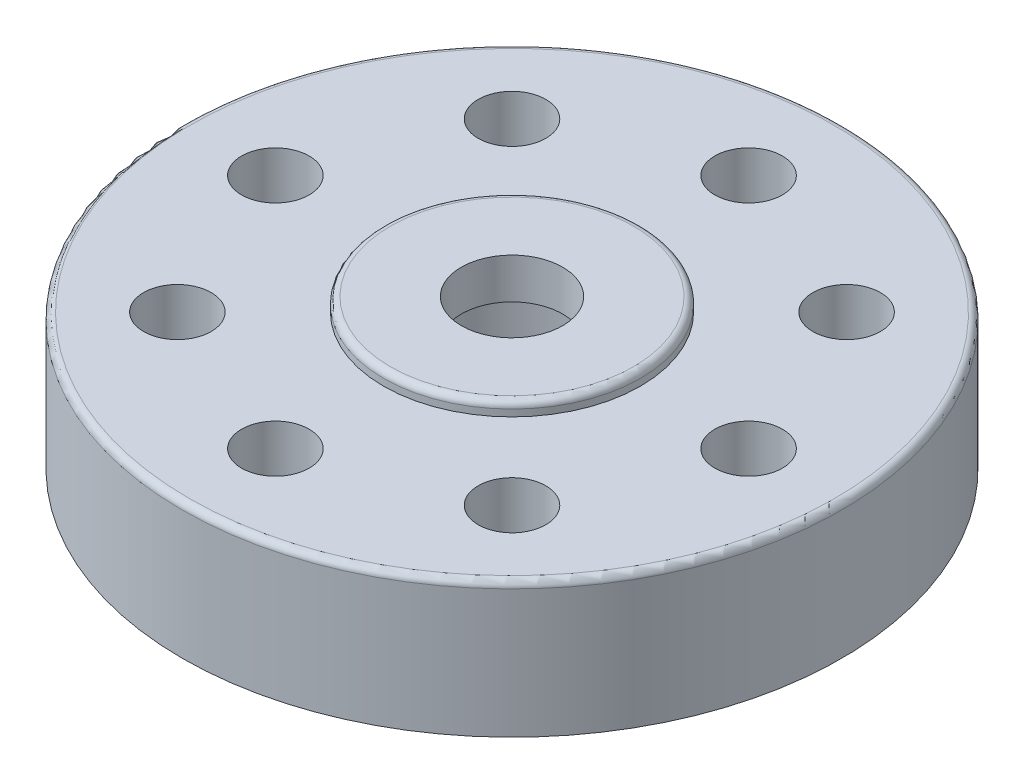
ISO-10303-21;
HEADER;
FILE_DESCRIPTION(('STEP AP214'),'2;1');
FILE_NAME('part.step','',(''),(''),'','','');
FILE_SCHEMA(('AUTOMOTIVE_DESIGN { 1 0 10303 214 1 1 1 1 }'));
ENDSEC;
DATA;
#1=APPLICATION_CONTEXT('core data for automotive mechanical design processes');
#2=APPLICATION_PROTOCOL_DEFINITION('international standard','automotive_design',2000,#1);
#3=PRODUCT_CONTEXT('',#1,'mechanical');
#4=PRODUCT('Part','Part','',(#3));
#5=PRODUCT_RELATED_PRODUCT_CATEGORY('part','',(#4));
#6=PRODUCT_DEFINITION_FORMATION('','',#4);
#7=PRODUCT_DEFINITION_CONTEXT('part definition',#1,'design');
#8=PRODUCT_DEFINITION('design','',#6,#7);
#9=PRODUCT_DEFINITION_SHAPE('','',#8);
#10=(LENGTH_UNIT() NAMED_UNIT(*) SI_UNIT(.MILLI.,.METRE.));
#11=(NAMED_UNIT(*) PLANE_ANGLE_UNIT() SI_UNIT($,.RADIAN.));
#12=(NAMED_UNIT(*) SI_UNIT($,.STERADIAN.) SOLID_ANGLE_UNIT());
#13=UNCERTAINTY_MEASURE_WITH_UNIT(LENGTH_MEASURE(1.E-05),#10,'distance_accuracy_value','');
#14=(GEOMETRIC_REPRESENTATION_CONTEXT(3) GLOBAL_UNCERTAINTY_ASSIGNED_CONTEXT((#13)) GLOBAL_UNIT_ASSIGNED_CONTEXT((#10,
#11,#12)) REPRESENTATION_CONTEXT('',''));
#15=CARTESIAN_POINT('',(0.,0.,0.));
#16=DIRECTION('',(0.,0.,1.));
#17=DIRECTION('',(1.,0.,0.));
#18=AXIS2_PLACEMENT_3D('',#15,#16,#17);
#19=CARTESIAN_POINT('',(29.5924554137643,49.1135937849813,41.6369385314129));
#20=DIRECTION('',(0.,1.,0.));
#21=DIRECTION('',(0.,0.,1.));
#22=AXIS2_PLACEMENT_3D('',#19,#20,#21);
#23=TOROIDAL_SURFACE('',#22,9.55,0.2);
#24=CARTESIAN_POINT('',(29.5924554137643,49.1135937849813,41.6369385314129));
#25=DIRECTION('',(0.,-1.,0.));
#26=DIRECTION('',(0.,0.,1.));
#27=AXIS2_PLACEMENT_3D('',#24,#25,#26);
#28=CIRCLE('',#27,9.75);
#29=CARTESIAN_POINT('',(29.5924554137643,49.1135937849813,51.3869385314129));
#30=VERTEX_POINT('',#29);
#31=EDGE_CURVE('E215',#30,#30,#28,.T.);
#32=ORIENTED_EDGE('',*,*,#31,.F.);
#33=EDGE_LOOP('',(#32));
#34=FACE_BOUND('',#33,.T.);
#35=CARTESIAN_POINT('',(29.5924554137643,49.3135937849813,41.6369385314129));
#36=DIRECTION('',(0.,1.,0.));
#37=DIRECTION('',(0.,0.,1.));
#38=AXIS2_PLACEMENT_3D('',#35,#36,#37);
#39=CIRCLE('',#38,9.55);
#40=CARTESIAN_POINT('',(29.5924554137643,49.3135937849813,51.1869385314129));
#41=VERTEX_POINT('',#40);
#42=EDGE_CURVE('E162',#41,#41,#39,.T.);
#43=ORIENTED_EDGE('',*,*,#42,.F.);
#44=EDGE_LOOP('',(#43));
#45=FACE_BOUND('',#44,.T.);
#46=ADVANCED_FACE('F15',(#34,#45),#23,.T.);
#47=CARTESIAN_POINT('',(29.5924554137643,49.5135937849813,41.6369385314129));
#48=DIRECTION('',(0.,1.,0.));
#49=DIRECTION('',(0.,0.,1.));
#50=AXIS2_PLACEMENT_3D('',#47,#48,#49);
#51=TOROIDAL_SURFACE('',#50,3.6,0.2);
#52=CARTESIAN_POINT('',(29.5924554137643,49.5135937849813,41.6369385314129));
#53=DIRECTION('',(0.,-1.,0.));
#54=DIRECTION('',(0.,0.,1.));
#55=AXIS2_PLACEMENT_3D('',#52,#53,#54);
#56=CIRCLE('',#55,3.8);
#57=CARTESIAN_POINT('',(29.5924554137643,49.5135937849813,45.4369385314129));
#58=VERTEX_POINT('',#57);
#59=EDGE_CURVE('E223',#58,#58,#56,.T.);
#60=ORIENTED_EDGE('',*,*,#59,.F.);
#61=EDGE_LOOP('',(#60));
#62=FACE_BOUND('',#61,.T.);
#63=CARTESIAN_POINT('',(29.5924554137643,49.7135937849813,41.6369385314129));
#64=DIRECTION('',(0.,1.,0.));
#65=DIRECTION('',(0.,0.,1.));
#66=AXIS2_PLACEMENT_3D('',#63,#64,#65);
#67=CIRCLE('',#66,3.6);
#68=CARTESIAN_POINT('',(29.5924554137643,49.7135937849813,45.2369385314129));
#69=VERTEX_POINT('',#68);
#70=EDGE_CURVE('E206',#69,#69,#67,.T.);
#71=ORIENTED_EDGE('',*,*,#70,.F.);
#72=EDGE_LOOP('',(#71));
#73=FACE_BOUND('',#72,.T.);
#74=ADVANCED_FACE('F557',(#62,#73),#51,.T.);
#75=CARTESIAN_POINT('',(29.5924554137643,48.5135937849813,41.6369385314129));
#76=DIRECTION('',(0.,1.,0.));
#77=DIRECTION('',(0.,0.,1.));
#78=AXIS2_PLACEMENT_3D('',#75,#76,#77);
#79=CYLINDRICAL_SURFACE('',#78,1.5);
#80=CARTESIAN_POINT('',(29.5924554137643,48.5135937849813,41.6369385314129));
#81=DIRECTION('',(0.,1.,0.));
#82=DIRECTION('',(0.,0.,1.));
#83=AXIS2_PLACEMENT_3D('',#80,#81,#82);
#84=CIRCLE('',#83,1.5);
#85=CARTESIAN_POINT('',(29.5924554137643,48.5135937849813,43.1369385314129));
#86=VERTEX_POINT('',#85);
#87=EDGE_CURVE('E10',#86,#86,#84,.T.);
#88=ORIENTED_EDGE('',*,*,#87,.F.);
#89=EDGE_LOOP('',(#88));
#90=FACE_BOUND('',#89,.T.);
#91=CARTESIAN_POINT('',(29.5924554137643,49.7135937849813,41.6369385314129));
#92=DIRECTION('',(0.,1.,0.));
#93=DIRECTION('',(0.,0.,1.));
#94=AXIS2_PLACEMENT_3D('',#91,#92,#93);
#95=CIRCLE('',#94,1.5);
#96=CARTESIAN_POINT('',(29.5924554137643,49.7135937849813,43.1369385314129));
#97=VERTEX_POINT('',#96);
#98=EDGE_CURVE('E202',#97,#97,#95,.T.);
#99=ORIENTED_EDGE('',*,*,#98,.T.);
#100=EDGE_LOOP('',(#99));
#101=FACE_BOUND('',#100,.T.);
#102=ADVANCED_FACE('F370',(#90,#101),#79,.F.);
#103=CARTESIAN_POINT('',(29.5924554137643,48.5135937849813,41.6369385314129));
#104=DIRECTION('',(0.,1.,0.));
#105=DIRECTION('',(1.,0.,0.));
#106=AXIS2_PLACEMENT_3D('',#103,#104,#105);
#107=PLANE('',#106);
#108=ORIENTED_EDGE('',*,*,#87,.T.);
#109=EDGE_LOOP('',(#108));
#110=FACE_BOUND('',#109,.T.);
#111=CARTESIAN_POINT('',(29.5924554137643,48.5135937849813,41.6369385314129));
#112=DIRECTION('',(0.,1.,0.));
#113=DIRECTION('',(0.,0.,1.));
#114=AXIS2_PLACEMENT_3D('',#111,#112,#113);
#115=CIRCLE('',#114,2.75);
#116=CARTESIAN_POINT('',(29.5924554137643,48.5135937849813,44.3869385314129));
#117=VERTEX_POINT('',#116);
#118=EDGE_CURVE('E23',#117,#117,#115,.T.);
#119=ORIENTED_EDGE('',*,*,#118,.F.);
#120=EDGE_LOOP('',(#119));
#121=FACE_BOUND('',#120,.T.);
#122=ADVANCED_FACE('F364',(#110,#121),#107,.F.);
#123=CARTESIAN_POINT('',(29.5924554137643,48.5135937849813,41.6369385314129));
#124=DIRECTION('',(0.,1.,0.));
#125=DIRECTION('',(0.,0.,1.));
#126=AXIS2_PLACEMENT_3D('',#123,#124,#125);
#127=CYLINDRICAL_SURFACE('',#126,2.75);
#128=ORIENTED_EDGE('',*,*,#118,.T.);
#129=EDGE_LOOP('',(#128));
#130=FACE_BOUND('',#129,.T.);
#131=CARTESIAN_POINT('',(29.5924554137643,49.3135937849813,41.6369385314129));
#132=DIRECTION('',(0.,1.,0.));
#133=DIRECTION('',(0.,0.,1.));
#134=AXIS2_PLACEMENT_3D('',#131,#132,#133);
#135=CIRCLE('',#134,2.75);
#136=CARTESIAN_POINT('',(29.5924554137643,49.3135937849813,44.3869385314129));
#137=VERTEX_POINT('',#136);
#138=EDGE_CURVE('E205',#137,#137,#135,.T.);
#139=ORIENTED_EDGE('',*,*,#138,.F.);
#140=EDGE_LOOP('',(#139));
#141=FACE_BOUND('',#140,.T.);
#142=ADVANCED_FACE('F369',(#130,#141),#127,.T.);
#143=CARTESIAN_POINT('',(29.5924554137643,49.7135937849813,41.6369385314129));
#144=DIRECTION('',(0.,-1.,0.));
#145=DIRECTION('',(0.,0.,-1.));
#146=AXIS2_PLACEMENT_3D('',#143,#144,#145);
#147=CYLINDRICAL_SURFACE('',#146,3.8);
#148=ORIENTED_EDGE('',*,*,#59,.T.);
#149=EDGE_LOOP('',(#148));
#150=FACE_BOUND('',#149,.T.);
#151=CARTESIAN_POINT('',(29.5924554137643,49.3135937849813,41.6369385314129));
#152=DIRECTION('',(0.,1.,0.));
#153=DIRECTION('',(0.,0.,1.));
#154=AXIS2_PLACEMENT_3D('',#151,#152,#153);
#155=CIRCLE('',#154,3.8);
#156=CARTESIAN_POINT('',(29.5924554137643,49.3135937849813,45.4369385314129));
#157=VERTEX_POINT('',#156);
#158=EDGE_CURVE('E170',#157,#157,#155,.T.);
#159=ORIENTED_EDGE('',*,*,#158,.T.);
#160=EDGE_LOOP('',(#159));
#161=FACE_BOUND('',#160,.T.);
#162=ADVANCED_FACE('F406',(#150,#161),#147,.T.);
#163=CARTESIAN_POINT('',(29.5924554137643,49.3135937849813,41.6369385314129));
#164=DIRECTION('',(0.,1.,0.));
#165=DIRECTION('',(1.,0.,0.));
#166=AXIS2_PLACEMENT_3D('',#163,#164,#165);
#167=PLANE('',#166);
#168=ORIENTED_EDGE('',*,*,#138,.T.);
#169=EDGE_LOOP('',(#168));
#170=FACE_BOUND('',#169,.T.);
#171=CARTESIAN_POINT('',(29.5924554137643,49.3135937849813,41.6369385314129));
#172=DIRECTION('',(0.,1.,0.));
#173=DIRECTION('',(0.,0.,1.));
#174=AXIS2_PLACEMENT_3D('',#171,#172,#173);
#175=CIRCLE('',#174,3.);
#176=CARTESIAN_POINT('',(29.5924554137643,49.3135937849813,44.6369385314129));
#177=VERTEX_POINT('',#176);
#178=EDGE_CURVE('E218',#177,#177,#175,.T.);
#179=ORIENTED_EDGE('',*,*,#178,.F.);
#180=EDGE_LOOP('',(#179));
#181=FACE_BOUND('',#180,.T.);
#182=ADVANCED_FACE('F410',(#170,#181),#167,.F.);
#183=CARTESIAN_POINT('',(29.5924554137643,49.7135937849813,41.6369385314129));
#184=DIRECTION('',(0.,1.,0.));
#185=DIRECTION('',(1.,0.,0.));
#186=AXIS2_PLACEMENT_3D('',#183,#184,#185);
#187=PLANE('',#186);
#188=ORIENTED_EDGE('',*,*,#98,.F.);
#189=EDGE_LOOP('',(#188));
#190=FACE_BOUND('',#189,.T.);
#191=ORIENTED_EDGE('',*,*,#70,.T.);
#192=EDGE_LOOP('',(#191));
#193=FACE_BOUND('',#192,.T.);
#194=ADVANCED_FACE('F422',(#190,#193),#187,.T.);
#195=CARTESIAN_POINT('',(34.5422028820702,49.3135937849813,36.6871910631072));
#196=DIRECTION('',(0.,-1.,0.));
#197=DIRECTION('',(0.,0.,-1.));
#198=AXIS2_PLACEMENT_3D('',#195,#196,#197);
#199=CYLINDRICAL_SURFACE('',#198,1.);
#200=CARTESIAN_POINT('',(34.5422028820702,49.3135937849813,36.6871910631072));
#201=DIRECTION('',(0.,1.,0.));
#202=DIRECTION('',(0.,0.,1.));
#203=AXIS2_PLACEMENT_3D('',#200,#201,#202);
#204=CIRCLE('',#203,1.);
#205=CARTESIAN_POINT('',(34.5422028820702,49.3135937849813,37.6871910631072));
#206=VERTEX_POINT('',#205);
#207=EDGE_CURVE('E153',#206,#206,#204,.T.);
#208=ORIENTED_EDGE('',*,*,#207,.T.);
#209=EDGE_LOOP('',(#208));
#210=FACE_BOUND('',#209,.T.);
#211=CARTESIAN_POINT('',(34.5422028820702,45.3135937849813,36.6871910631072));
#212=DIRECTION('',(0.,1.,0.));
#213=DIRECTION('',(0.,0.,1.));
#214=AXIS2_PLACEMENT_3D('',#211,#212,#213);
#215=CIRCLE('',#214,1.);
#216=CARTESIAN_POINT('',(34.5422028820702,45.3135937849813,37.6871910631072));
#217=VERTEX_POINT('',#216);
#218=EDGE_CURVE('E212',#217,#217,#215,.T.);
#219=ORIENTED_EDGE('',*,*,#218,.F.);
#220=EDGE_LOOP('',(#219));
#221=FACE_BOUND('',#220,.T.);
#222=ADVANCED_FACE('F455',(#210,#221),#199,.F.);
#223=CARTESIAN_POINT('',(29.5924554137645,49.3135937849813,34.6369385314129));
#224=DIRECTION('',(0.,-1.,0.));
#225=DIRECTION('',(0.,0.,-1.));
#226=AXIS2_PLACEMENT_3D('',#223,#224,#225);
#227=CYLINDRICAL_SURFACE('',#226,1.);
#228=CARTESIAN_POINT('',(29.5924554137645,49.3135937849813,34.6369385314129));
#229=DIRECTION('',(0.,1.,0.));
#230=DIRECTION('',(0.,0.,1.));
#231=AXIS2_PLACEMENT_3D('',#228,#229,#230);
#232=CIRCLE('',#231,1.);
#233=CARTESIAN_POINT('',(29.5924554137645,49.3135937849813,35.6369385314129));
#234=VERTEX_POINT('',#233);
#235=EDGE_CURVE('E168',#234,#234,#232,.T.);
#236=ORIENTED_EDGE('',*,*,#235,.T.);
#237=EDGE_LOOP('',(#236));
#238=FACE_BOUND('',#237,.T.);
#239=CARTESIAN_POINT('',(29.5924554137645,45.3135937849813,34.6369385314129));
#240=DIRECTION('',(0.,1.,0.));
#241=DIRECTION('',(0.,0.,1.));
#242=AXIS2_PLACEMENT_3D('',#239,#240,#241);
#243=CIRCLE('',#242,1.);
#244=CARTESIAN_POINT('',(29.5924554137645,45.3135937849813,35.6369385314129));
#245=VERTEX_POINT('',#244);
#246=EDGE_CURVE('E183',#245,#245,#243,.T.);
#247=ORIENTED_EDGE('',*,*,#246,.F.);
#248=EDGE_LOOP('',(#247));
#249=FACE_BOUND('',#248,.T.);
#250=ADVANCED_FACE('F459',(#238,#249),#227,.F.);
#251=CARTESIAN_POINT('',(24.6427079454586,49.3135937849813,36.6871910631071));
#252=DIRECTION('',(0.,-1.,0.));
#253=DIRECTION('',(0.,0.,-1.));
#254=AXIS2_PLACEMENT_3D('',#251,#252,#253);
#255=CYLINDRICAL_SURFACE('',#254,1.);
#256=CARTESIAN_POINT('',(24.6427079454586,49.3135937849813,36.6871910631071));
#257=DIRECTION('',(0.,1.,0.));
#258=DIRECTION('',(0.,0.,1.));
#259=AXIS2_PLACEMENT_3D('',#256,#257,#258);
#260=CIRCLE('',#259,1.);
#261=CARTESIAN_POINT('',(24.6427079454586,49.3135937849813,37.6871910631071));
#262=VERTEX_POINT('',#261);
#263=EDGE_CURVE('E147',#262,#262,#260,.T.);
#264=ORIENTED_EDGE('',*,*,#263,.T.);
#265=EDGE_LOOP('',(#264));
#266=FACE_BOUND('',#265,.T.);
#267=CARTESIAN_POINT('',(24.6427079454586,45.3135937849813,36.6871910631071));
#268=DIRECTION('',(0.,1.,0.));
#269=DIRECTION('',(0.,0.,1.));
#270=AXIS2_PLACEMENT_3D('',#267,#268,#269);
#271=CIRCLE('',#270,1.);
#272=CARTESIAN_POINT('',(24.6427079454586,45.3135937849813,37.6871910631071));
#273=VERTEX_POINT('',#272);
#274=EDGE_CURVE('E209',#273,#273,#271,.T.);
#275=ORIENTED_EDGE('',*,*,#274,.F.);
#276=EDGE_LOOP('',(#275));
#277=FACE_BOUND('',#276,.T.);
#278=ADVANCED_FACE('F148',(#266,#277),#255,.F.);
#279=CARTESIAN_POINT('',(22.5924554137643,49.3135937849813,41.6369385314129));
#280=DIRECTION('',(0.,-1.,0.));
#281=DIRECTION('',(0.,0.,-1.));
#282=AXIS2_PLACEMENT_3D('',#279,#280,#281);
#283=CYLINDRICAL_SURFACE('',#282,1.);
#284=CARTESIAN_POINT('',(22.5924554137643,49.3135937849813,41.6369385314129));
#285=DIRECTION('',(0.,1.,0.));
#286=DIRECTION('',(0.,0.,1.));
#287=AXIS2_PLACEMENT_3D('',#284,#285,#286);
#288=CIRCLE('',#287,1.);
#289=CARTESIAN_POINT('',(22.5924554137643,49.3135937849813,42.6369385314129));
#290=VERTEX_POINT('',#289);
#291=EDGE_CURVE('E171',#290,#290,#288,.T.);
#292=ORIENTED_EDGE('',*,*,#291,.T.);
#293=EDGE_LOOP('',(#292));
#294=FACE_BOUND('',#293,.T.);
#295=CARTESIAN_POINT('',(22.5924554137643,45.3135937849813,41.6369385314129));
#296=DIRECTION('',(0.,1.,0.));
#297=DIRECTION('',(0.,0.,1.));
#298=AXIS2_PLACEMENT_3D('',#295,#296,#297);
#299=CIRCLE('',#298,1.);
#300=CARTESIAN_POINT('',(22.5924554137643,45.3135937849813,42.6369385314129));
#301=VERTEX_POINT('',#300);
#302=EDGE_CURVE('E179',#301,#301,#299,.T.);
#303=ORIENTED_EDGE('',*,*,#302,.F.);
#304=EDGE_LOOP('',(#303));
#305=FACE_BOUND('',#304,.T.);
#306=ADVANCED_FACE('F527',(#294,#305),#283,.F.);
#307=CARTESIAN_POINT('',(24.6427079454585,49.3135937849813,46.5866859997187));
#308=DIRECTION('',(0.,-1.,0.));
#309=DIRECTION('',(0.,0.,-1.));
#310=AXIS2_PLACEMENT_3D('',#307,#308,#309);
#311=CYLINDRICAL_SURFACE('',#310,1.);
#312=CARTESIAN_POINT('',(24.6427079454585,49.3135937849813,46.5866859997187));
#313=DIRECTION('',(0.,1.,0.));
#314=DIRECTION('',(0.,0.,1.));
#315=AXIS2_PLACEMENT_3D('',#312,#313,#314);
#316=CIRCLE('',#315,1.);
#317=CARTESIAN_POINT('',(24.6427079454585,49.3135937849813,47.5866859997187));
#318=VERTEX_POINT('',#317);
#319=EDGE_CURVE('E152',#318,#318,#316,.T.);
#320=ORIENTED_EDGE('',*,*,#319,.T.);
#321=EDGE_LOOP('',(#320));
#322=FACE_BOUND('',#321,.T.);
#323=CARTESIAN_POINT('',(24.6427079454585,45.3135937849813,46.5866859997187));
#324=DIRECTION('',(0.,1.,0.));
#325=DIRECTION('',(0.,0.,1.));
#326=AXIS2_PLACEMENT_3D('',#323,#324,#325);
#327=CIRCLE('',#326,1.);
#328=CARTESIAN_POINT('',(24.6427079454585,45.3135937849813,47.5866859997187));
#329=VERTEX_POINT('',#328);
#330=EDGE_CURVE('E201',#329,#329,#327,.T.);
#331=ORIENTED_EDGE('',*,*,#330,.F.);
#332=EDGE_LOOP('',(#331));
#333=FACE_BOUND('',#332,.T.);
#334=ADVANCED_FACE('F384',(#322,#333),#311,.F.);
#335=CARTESIAN_POINT('',(29.5924554137643,49.3135937849813,48.6369385314129));
#336=DIRECTION('',(0.,-1.,0.));
#337=DIRECTION('',(0.,0.,-1.));
#338=AXIS2_PLACEMENT_3D('',#335,#336,#337);
#339=CYLINDRICAL_SURFACE('',#338,1.);
#340=CARTESIAN_POINT('',(29.5924554137643,49.3135937849813,48.6369385314129));
#341=DIRECTION('',(0.,1.,0.));
#342=DIRECTION('',(0.,0.,1.));
#343=AXIS2_PLACEMENT_3D('',#340,#341,#342);
#344=CIRCLE('',#343,1.);
#345=CARTESIAN_POINT('',(29.5924554137643,49.3135937849813,49.6369385314129));
#346=VERTEX_POINT('',#345);
#347=EDGE_CURVE('E180',#346,#346,#344,.T.);
#348=ORIENTED_EDGE('',*,*,#347,.T.);
#349=EDGE_LOOP('',(#348));
#350=FACE_BOUND('',#349,.T.);
#351=CARTESIAN_POINT('',(29.5924554137643,45.3135937849813,48.6369385314129));
#352=DIRECTION('',(0.,1.,0.));
#353=DIRECTION('',(0.,0.,1.));
#354=AXIS2_PLACEMENT_3D('',#351,#352,#353);
#355=CIRCLE('',#354,1.);
#356=CARTESIAN_POINT('',(29.5924554137643,45.3135937849813,49.6369385314129));
#357=VERTEX_POINT('',#356);
#358=EDGE_CURVE('E175',#357,#357,#355,.T.);
#359=ORIENTED_EDGE('',*,*,#358,.F.);
#360=EDGE_LOOP('',(#359));
#361=FACE_BOUND('',#360,.T.);
#362=ADVANCED_FACE('F379',(#350,#361),#339,.F.);
#363=CARTESIAN_POINT('',(34.5422028820702,49.3135937849813,46.5866859997188));
#364=DIRECTION('',(0.,-1.,0.));
#365=DIRECTION('',(0.,0.,-1.));
#366=AXIS2_PLACEMENT_3D('',#363,#364,#365);
#367=CYLINDRICAL_SURFACE('',#366,1.);
#368=CARTESIAN_POINT('',(34.5422028820702,49.3135937849813,46.5866859997188));
#369=DIRECTION('',(0.,1.,0.));
#370=DIRECTION('',(0.,0.,1.));
#371=AXIS2_PLACEMENT_3D('',#368,#369,#370);
#372=CIRCLE('',#371,1.);
#373=CARTESIAN_POINT('',(34.5422028820702,49.3135937849813,47.5866859997188));
#374=VERTEX_POINT('',#373);
#375=EDGE_CURVE('E160',#374,#374,#372,.T.);
#376=ORIENTED_EDGE('',*,*,#375,.T.);
#377=EDGE_LOOP('',(#376));
#378=FACE_BOUND('',#377,.T.);
#379=CARTESIAN_POINT('',(34.5422028820702,45.3135937849813,46.5866859997188));
#380=DIRECTION('',(0.,1.,0.));
#381=DIRECTION('',(0.,0.,1.));
#382=AXIS2_PLACEMENT_3D('',#379,#380,#381);
#383=CIRCLE('',#382,1.);
#384=CARTESIAN_POINT('',(34.5422028820702,45.3135937849813,47.5866859997188));
#385=VERTEX_POINT('',#384);
#386=EDGE_CURVE('E198',#385,#385,#383,.T.);
#387=ORIENTED_EDGE('',*,*,#386,.F.);
#388=EDGE_LOOP('',(#387));
#389=FACE_BOUND('',#388,.T.);
#390=ADVANCED_FACE('F383',(#378,#389),#367,.F.);
#391=CARTESIAN_POINT('',(36.5924554137644,49.3135937849813,41.6369385314129));
#392=DIRECTION('',(0.,-1.,0.));
#393=DIRECTION('',(0.,0.,-1.));
#394=AXIS2_PLACEMENT_3D('',#391,#392,#393);
#395=CYLINDRICAL_SURFACE('',#394,1.);
#396=CARTESIAN_POINT('',(36.5924554137644,49.3135937849813,41.6369385314129));
#397=DIRECTION('',(0.,1.,0.));
#398=DIRECTION('',(0.,0.,1.));
#399=AXIS2_PLACEMENT_3D('',#396,#397,#398);
#400=CIRCLE('',#399,1.);
#401=CARTESIAN_POINT('',(36.5924554137644,49.3135937849813,42.6369385314129));
#402=VERTEX_POINT('',#401);
#403=EDGE_CURVE('E166',#402,#402,#400,.T.);
#404=ORIENTED_EDGE('',*,*,#403,.T.);
#405=EDGE_LOOP('',(#404));
#406=FACE_BOUND('',#405,.T.);
#407=CARTESIAN_POINT('',(36.5924554137644,45.3135937849813,41.6369385314129));
#408=DIRECTION('',(0.,1.,0.));
#409=DIRECTION('',(0.,0.,1.));
#410=AXIS2_PLACEMENT_3D('',#407,#408,#409);
#411=CIRCLE('',#410,1.);
#412=CARTESIAN_POINT('',(36.5924554137644,45.3135937849813,42.6369385314129));
#413=VERTEX_POINT('',#412);
#414=EDGE_CURVE('E178',#413,#413,#411,.T.);
#415=ORIENTED_EDGE('',*,*,#414,.F.);
#416=EDGE_LOOP('',(#415));
#417=FACE_BOUND('',#416,.T.);
#418=ADVANCED_FACE('F482',(#406,#417),#395,.F.);
#419=CARTESIAN_POINT('',(29.5924554137643,49.3135937849813,41.6369385314129));
#420=DIRECTION('',(0.,-1.,0.));
#421=DIRECTION('',(0.,0.,-1.));
#422=AXIS2_PLACEMENT_3D('',#419,#420,#421);
#423=CYLINDRICAL_SURFACE('',#422,3.);
#424=ORIENTED_EDGE('',*,*,#178,.T.);
#425=EDGE_LOOP('',(#424));
#426=FACE_BOUND('',#425,.T.);
#427=CARTESIAN_POINT('',(29.5924554137643,45.3135937849813,41.6369385314129));
#428=DIRECTION('',(0.,1.,0.));
#429=DIRECTION('',(0.,0.,1.));
#430=AXIS2_PLACEMENT_3D('',#427,#428,#429);
#431=CIRCLE('',#430,3.);
#432=CARTESIAN_POINT('',(29.5924554137643,45.3135937849813,44.6369385314129));
#433=VERTEX_POINT('',#432);
#434=EDGE_CURVE('E195',#433,#433,#431,.T.);
#435=ORIENTED_EDGE('',*,*,#434,.F.);
#436=EDGE_LOOP('',(#435));
#437=FACE_BOUND('',#436,.T.);
#438=ADVANCED_FACE('F446',(#426,#437),#423,.F.);
#439=CARTESIAN_POINT('',(29.5924554137643,49.3135937849813,41.6369385314129));
#440=DIRECTION('',(0.,-1.,0.));
#441=DIRECTION('',(0.,0.,-1.));
#442=AXIS2_PLACEMENT_3D('',#439,#440,#441);
#443=CYLINDRICAL_SURFACE('',#442,9.75);
#444=ORIENTED_EDGE('',*,*,#31,.T.);
#445=EDGE_LOOP('',(#444));
#446=FACE_BOUND('',#445,.T.);
#447=CARTESIAN_POINT('',(29.5924554137643,45.3135937849813,41.6369385314129));
#448=DIRECTION('',(0.,1.,0.));
#449=DIRECTION('',(0.,0.,1.));
#450=AXIS2_PLACEMENT_3D('',#447,#448,#449);
#451=CIRCLE('',#450,9.75);
#452=CARTESIAN_POINT('',(29.5924554137643,45.3135937849813,51.3869385314129));
#453=VERTEX_POINT('',#452);
#454=EDGE_CURVE('E186',#453,#453,#451,.T.);
#455=ORIENTED_EDGE('',*,*,#454,.T.);
#456=EDGE_LOOP('',(#455));
#457=FACE_BOUND('',#456,.T.);
#458=ADVANCED_FACE('F434',(#446,#457),#443,.T.);
#459=CARTESIAN_POINT('',(29.5924554137643,45.3135937849813,41.6369385314129));
#460=DIRECTION('',(0.,1.,0.));
#461=DIRECTION('',(1.,0.,0.));
#462=AXIS2_PLACEMENT_3D('',#459,#460,#461);
#463=PLANE('',#462);
#464=ORIENTED_EDGE('',*,*,#218,.T.);
#465=EDGE_LOOP('',(#464));
#466=FACE_BOUND('',#465,.T.);
#467=ORIENTED_EDGE('',*,*,#274,.T.);
#468=EDGE_LOOP('',(#467));
#469=FACE_BOUND('',#468,.T.);
#470=ORIENTED_EDGE('',*,*,#330,.T.);
#471=EDGE_LOOP('',(#470));
#472=FACE_BOUND('',#471,.T.);
#473=ORIENTED_EDGE('',*,*,#386,.T.);
#474=EDGE_LOOP('',(#473));
#475=FACE_BOUND('',#474,.T.);
#476=ORIENTED_EDGE('',*,*,#434,.T.);
#477=EDGE_LOOP('',(#476));
#478=FACE_BOUND('',#477,.T.);
#479=ORIENTED_EDGE('',*,*,#414,.T.);
#480=EDGE_LOOP('',(#479));
#481=FACE_BOUND('',#480,.T.);
#482=ORIENTED_EDGE('',*,*,#358,.T.);
#483=EDGE_LOOP('',(#482));
#484=FACE_BOUND('',#483,.T.);
#485=ORIENTED_EDGE('',*,*,#302,.T.);
#486=EDGE_LOOP('',(#485));
#487=FACE_BOUND('',#486,.T.);
#488=ORIENTED_EDGE('',*,*,#246,.T.);
#489=EDGE_LOOP('',(#488));
#490=FACE_BOUND('',#489,.T.);
#491=ORIENTED_EDGE('',*,*,#454,.F.);
#492=EDGE_LOOP('',(#491));
#493=FACE_BOUND('',#492,.T.);
#494=ADVANCED_FACE('F397',(#466,#469,#472,#475,#478,#481,#484,#487,#490,#493),#463,.F.);
#495=CARTESIAN_POINT('',(29.5924554137643,49.3135937849813,41.6369385314129));
#496=DIRECTION('',(0.,1.,0.));
#497=DIRECTION('',(1.,0.,0.));
#498=AXIS2_PLACEMENT_3D('',#495,#496,#497);
#499=PLANE('',#498);
#500=ORIENTED_EDGE('',*,*,#158,.F.);
#501=EDGE_LOOP('',(#500));
#502=FACE_BOUND('',#501,.T.);
#503=ORIENTED_EDGE('',*,*,#235,.F.);
#504=EDGE_LOOP('',(#503));
#505=FACE_BOUND('',#504,.T.);
#506=ORIENTED_EDGE('',*,*,#291,.F.);
#507=EDGE_LOOP('',(#506));
#508=FACE_BOUND('',#507,.T.);
#509=ORIENTED_EDGE('',*,*,#347,.F.);
#510=EDGE_LOOP('',(#509));
#511=FACE_BOUND('',#510,.T.);
#512=ORIENTED_EDGE('',*,*,#403,.F.);
#513=EDGE_LOOP('',(#512));
#514=FACE_BOUND('',#513,.T.);
#515=ORIENTED_EDGE('',*,*,#375,.F.);
#516=EDGE_LOOP('',(#515));
#517=FACE_BOUND('',#516,.T.);
#518=ORIENTED_EDGE('',*,*,#319,.F.);
#519=EDGE_LOOP('',(#518));
#520=FACE_BOUND('',#519,.T.);
#521=ORIENTED_EDGE('',*,*,#263,.F.);
#522=EDGE_LOOP('',(#521));
#523=FACE_BOUND('',#522,.T.);
#524=ORIENTED_EDGE('',*,*,#207,.F.);
#525=EDGE_LOOP('',(#524));
#526=FACE_BOUND('',#525,.T.);
#527=ORIENTED_EDGE('',*,*,#42,.T.);
#528=EDGE_LOOP('',(#527));
#529=FACE_BOUND('',#528,.T.);
#530=ADVANCED_FACE('F393',(#502,#505,#508,#511,#514,#517,#520,#523,#526,#529),#499,.T.);
#531=CLOSED_SHELL('',(#46,#74,#102,#122,#142,#162,#182,#194,#222,#250,#278,#306,#334,#362,#390,
#418,#438,#458,#494,#530));
#532=MANIFOLD_SOLID_BREP('B1',#531);
#533=ADVANCED_BREP_SHAPE_REPRESENTATION('',(#18,#532),#14);
#534=SHAPE_DEFINITION_REPRESENTATION(#9,#533);
ENDSEC;
END-ISO-10303-21;
